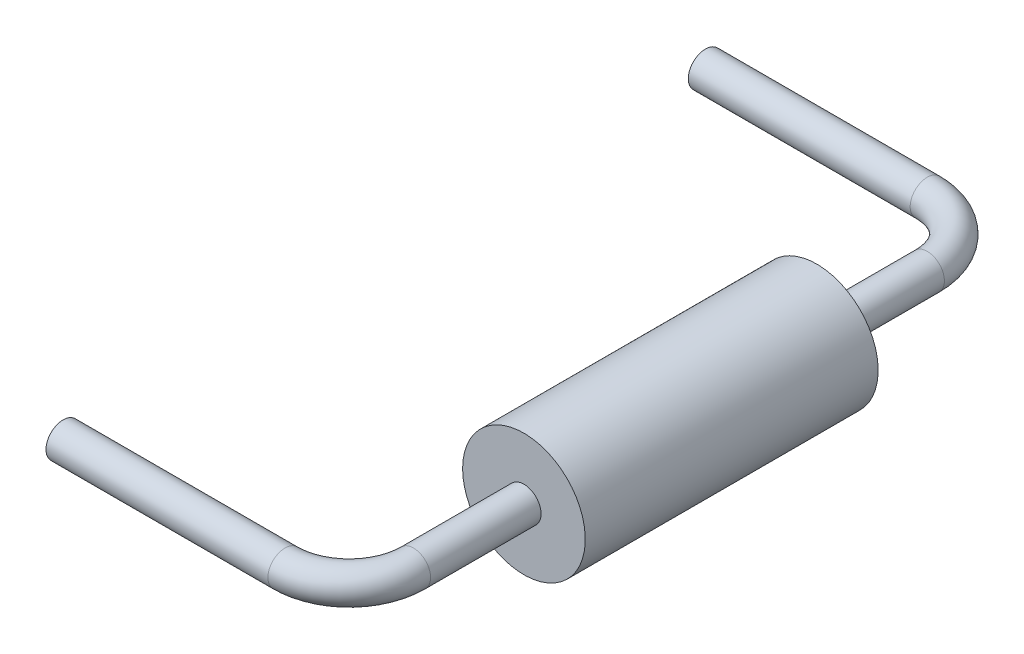
ISO-10303-21;
HEADER;
FILE_DESCRIPTION(('STEP AP214'),'2;1');
FILE_NAME('part.step','',(''),(''),'','','');
FILE_SCHEMA(('AUTOMOTIVE_DESIGN { 1 0 10303 214 1 1 1 1 }'));
ENDSEC;
DATA;
#1=APPLICATION_CONTEXT('core data for automotive mechanical design processes');
#2=APPLICATION_PROTOCOL_DEFINITION('international standard','automotive_design',2000,#1);
#3=PRODUCT_CONTEXT('',#1,'mechanical');
#4=PRODUCT('Part','Part','',(#3));
#5=PRODUCT_RELATED_PRODUCT_CATEGORY('part','',(#4));
#6=PRODUCT_DEFINITION_FORMATION('','',#4);
#7=PRODUCT_DEFINITION_CONTEXT('part definition',#1,'design');
#8=PRODUCT_DEFINITION('design','',#6,#7);
#9=PRODUCT_DEFINITION_SHAPE('','',#8);
#10=(LENGTH_UNIT() NAMED_UNIT(*) SI_UNIT(.MILLI.,.METRE.));
#11=(NAMED_UNIT(*) PLANE_ANGLE_UNIT() SI_UNIT($,.RADIAN.));
#12=(NAMED_UNIT(*) SI_UNIT($,.STERADIAN.) SOLID_ANGLE_UNIT());
#13=UNCERTAINTY_MEASURE_WITH_UNIT(LENGTH_MEASURE(1.E-05),#10,'distance_accuracy_value','');
#14=(GEOMETRIC_REPRESENTATION_CONTEXT(3) GLOBAL_UNCERTAINTY_ASSIGNED_CONTEXT((#13)) GLOBAL_UNIT_ASSIGNED_CONTEXT((#10,
#11,#12)) REPRESENTATION_CONTEXT('',''));
#15=CARTESIAN_POINT('',(0.,0.,0.));
#16=DIRECTION('',(0.,0.,1.));
#17=DIRECTION('',(1.,0.,0.));
#18=AXIS2_PLACEMENT_3D('',#15,#16,#17);
#19=CARTESIAN_POINT('',(-4.455,0.,-5.));
#20=DIRECTION('',(-1.,0.,0.));
#21=DIRECTION('',(0.,0.,1.));
#22=AXIS2_PLACEMENT_3D('',#19,#20,#21);
#23=PLANE('',#22);
#24=CARTESIAN_POINT('',(-4.455,0.,-5.));
#25=DIRECTION('',(-1.,0.,0.));
#26=DIRECTION('',(0.,-1.,0.));
#27=AXIS2_PLACEMENT_3D('',#24,#25,#26);
#28=CIRCLE('',#27,0.2665);
#29=CARTESIAN_POINT('',(-4.455,-0.2665,-5.));
#30=VERTEX_POINT('',#29);
#31=EDGE_CURVE('E18',#30,#30,#28,.F.);
#32=ORIENTED_EDGE('',*,*,#31,.F.);
#33=EDGE_LOOP('',(#32));
#34=FACE_BOUND('',#33,.T.);
#35=ADVANCED_FACE('F15',(#34),#23,.T.);
#36=CARTESIAN_POINT('',(-4.455,0.,5.));
#37=DIRECTION('',(-1.,0.,0.));
#38=DIRECTION('',(0.,0.,1.));
#39=AXIS2_PLACEMENT_3D('',#36,#37,#38);
#40=PLANE('',#39);
#41=CARTESIAN_POINT('',(-4.455,0.,5.));
#42=DIRECTION('',(-1.,0.,0.));
#43=DIRECTION('',(0.,-1.,0.));
#44=AXIS2_PLACEMENT_3D('',#41,#42,#43);
#45=CIRCLE('',#44,0.2665);
#46=CARTESIAN_POINT('',(-4.455,-0.2665,5.));
#47=VERTEX_POINT('',#46);
#48=EDGE_CURVE('E38',#47,#47,#45,.F.);
#49=ORIENTED_EDGE('',*,*,#48,.F.);
#50=EDGE_LOOP('',(#49));
#51=FACE_BOUND('',#50,.T.);
#52=ADVANCED_FACE('F50',(#51),#40,.T.);
#53=CARTESIAN_POINT('',(-1.,0.,-5.));
#54=DIRECTION('',(-1.,0.,0.));
#55=DIRECTION('',(0.,-1.,0.));
#56=AXIS2_PLACEMENT_3D('',#53,#54,#55);
#57=CYLINDRICAL_SURFACE('',#56,0.2665);
#58=CARTESIAN_POINT('',(-1.,0.,-5.));
#59=DIRECTION('',(-1.,0.,0.));
#60=DIRECTION('',(0.,0.,-1.));
#61=AXIS2_PLACEMENT_3D('',#58,#59,#60);
#62=CIRCLE('',#61,0.2665);
#63=CARTESIAN_POINT('',(-0.999999999999999,0.,-5.2665));
#64=VERTEX_POINT('',#63);
#65=EDGE_CURVE('E40',#64,#64,#62,.F.);
#66=ORIENTED_EDGE('',*,*,#65,.F.);
#67=EDGE_LOOP('',(#66));
#68=FACE_BOUND('',#67,.T.);
#69=ORIENTED_EDGE('',*,*,#31,.T.);
#70=EDGE_LOOP('',(#69));
#71=FACE_BOUND('',#70,.T.);
#72=ADVANCED_FACE('F47',(#68,#71),#57,.T.);
#73=CARTESIAN_POINT('',(-1.,0.,5.));
#74=DIRECTION('',(-1.,0.,0.));
#75=DIRECTION('',(0.,-1.,0.));
#76=AXIS2_PLACEMENT_3D('',#73,#74,#75);
#77=CYLINDRICAL_SURFACE('',#76,0.2665);
#78=CARTESIAN_POINT('',(-1.,0.,5.));
#79=DIRECTION('',(-1.,0.,0.));
#80=DIRECTION('',(0.,0.,1.));
#81=AXIS2_PLACEMENT_3D('',#78,#79,#80);
#82=CIRCLE('',#81,0.2665);
#83=CARTESIAN_POINT('',(-0.999999999999999,0.,5.2665));
#84=VERTEX_POINT('',#83);
#85=EDGE_CURVE('E30',#84,#84,#82,.F.);
#86=ORIENTED_EDGE('',*,*,#85,.F.);
#87=EDGE_LOOP('',(#86));
#88=FACE_BOUND('',#87,.T.);
#89=ORIENTED_EDGE('',*,*,#48,.T.);
#90=EDGE_LOOP('',(#89));
#91=FACE_BOUND('',#90,.T.);
#92=ADVANCED_FACE('F99',(#88,#91),#77,.T.);
#93=CARTESIAN_POINT('',(-1.,0.,-4.));
#94=DIRECTION('',(0.,1.,0.));
#95=DIRECTION('',(0.,0.,1.));
#96=AXIS2_PLACEMENT_3D('',#93,#94,#95);
#97=TOROIDAL_SURFACE('',#96,1.,0.2665);
#98=ORIENTED_EDGE('',*,*,#65,.T.);
#99=EDGE_LOOP('',(#98));
#100=FACE_BOUND('',#99,.T.);
#101=CARTESIAN_POINT('',(0.,0.,-4.));
#102=DIRECTION('',(0.,0.,1.));
#103=DIRECTION('',(1.,0.,0.));
#104=AXIS2_PLACEMENT_3D('',#101,#102,#103);
#105=CIRCLE('',#104,0.2665);
#106=CARTESIAN_POINT('',(0.2665,0.,-4.));
#107=VERTEX_POINT('',#106);
#108=EDGE_CURVE('E92',#107,#107,#105,.T.);
#109=ORIENTED_EDGE('',*,*,#108,.F.);
#110=EDGE_LOOP('',(#109));
#111=FACE_BOUND('',#110,.T.);
#112=ADVANCED_FACE('F83',(#100,#111),#97,.T.);
#113=CARTESIAN_POINT('',(-1.,0.,4.));
#114=DIRECTION('',(0.,-1.,0.));
#115=DIRECTION('',(0.,0.,-1.));
#116=AXIS2_PLACEMENT_3D('',#113,#114,#115);
#117=TOROIDAL_SURFACE('',#116,1.,0.2665);
#118=CARTESIAN_POINT('',(0.,0.,4.));
#119=DIRECTION('',(0.,0.,-1.));
#120=DIRECTION('',(-1.,0.,0.));
#121=AXIS2_PLACEMENT_3D('',#118,#119,#120);
#122=CIRCLE('',#121,0.2665);
#123=CARTESIAN_POINT('',(-0.2665,0.,4.));
#124=VERTEX_POINT('',#123);
#125=EDGE_CURVE('E37',#124,#124,#122,.T.);
#126=ORIENTED_EDGE('',*,*,#125,.F.);
#127=EDGE_LOOP('',(#126));
#128=FACE_BOUND('',#127,.T.);
#129=ORIENTED_EDGE('',*,*,#85,.T.);
#130=EDGE_LOOP('',(#129));
#131=FACE_BOUND('',#130,.T.);
#132=ADVANCED_FACE('F78',(#128,#131),#117,.T.);
#133=CARTESIAN_POINT('',(0.,0.,4.));
#134=DIRECTION('',(0.,0.,-1.));
#135=DIRECTION('',(-1.,0.,0.));
#136=AXIS2_PLACEMENT_3D('',#133,#134,#135);
#137=CYLINDRICAL_SURFACE('',#136,0.2665);
#138=CARTESIAN_POINT('',(0.,0.,2.28));
#139=DIRECTION('',(0.,0.,-1.));
#140=DIRECTION('',(-1.,0.,0.));
#141=AXIS2_PLACEMENT_3D('',#138,#139,#140);
#142=CIRCLE('',#141,0.2665);
#143=CARTESIAN_POINT('',(-0.2665,0.,2.28));
#144=VERTEX_POINT('',#143);
#145=EDGE_CURVE('E35',#144,#144,#142,.T.);
#146=ORIENTED_EDGE('',*,*,#145,.F.);
#147=EDGE_LOOP('',(#146));
#148=FACE_BOUND('',#147,.T.);
#149=ORIENTED_EDGE('',*,*,#125,.T.);
#150=EDGE_LOOP('',(#149));
#151=FACE_BOUND('',#150,.T.);
#152=ADVANCED_FACE('F74',(#148,#151),#137,.T.);
#153=CARTESIAN_POINT('',(0.,0.,-4.));
#154=DIRECTION('',(0.,0.,1.));
#155=DIRECTION('',(1.,0.,0.));
#156=AXIS2_PLACEMENT_3D('',#153,#154,#155);
#157=CYLINDRICAL_SURFACE('',#156,0.2665);
#158=ORIENTED_EDGE('',*,*,#108,.T.);
#159=EDGE_LOOP('',(#158));
#160=FACE_BOUND('',#159,.T.);
#161=CARTESIAN_POINT('',(0.,0.,-2.28));
#162=DIRECTION('',(0.,0.,1.));
#163=DIRECTION('',(1.,0.,0.));
#164=AXIS2_PLACEMENT_3D('',#161,#162,#163);
#165=CIRCLE('',#164,0.2665);
#166=CARTESIAN_POINT('',(0.2665,0.,-2.28));
#167=VERTEX_POINT('',#166);
#168=EDGE_CURVE('E27',#167,#167,#165,.F.);
#169=ORIENTED_EDGE('',*,*,#168,.T.);
#170=EDGE_LOOP('',(#169));
#171=FACE_BOUND('',#170,.T.);
#172=ADVANCED_FACE('F70',(#160,#171),#157,.T.);
#173=CARTESIAN_POINT('',(0.,0.,2.28));
#174=DIRECTION('',(0.,0.,1.));
#175=DIRECTION('',(1.,0.,0.));
#176=AXIS2_PLACEMENT_3D('',#173,#174,#175);
#177=PLANE('',#176);
#178=CARTESIAN_POINT('',(0.,0.,2.28));
#179=DIRECTION('',(0.,0.,-1.));
#180=DIRECTION('',(-1.,0.,0.));
#181=AXIS2_PLACEMENT_3D('',#178,#179,#180);
#182=CIRCLE('',#181,0.955);
#183=CARTESIAN_POINT('',(-0.955,0.,2.28));
#184=VERTEX_POINT('',#183);
#185=EDGE_CURVE('E22',#184,#184,#182,.T.);
#186=ORIENTED_EDGE('',*,*,#185,.F.);
#187=EDGE_LOOP('',(#186));
#188=FACE_BOUND('',#187,.T.);
#189=ORIENTED_EDGE('',*,*,#145,.T.);
#190=EDGE_LOOP('',(#189));
#191=FACE_BOUND('',#190,.T.);
#192=ADVANCED_FACE('F63',(#188,#191),#177,.T.);
#193=CARTESIAN_POINT('',(0.,0.,-2.28));
#194=DIRECTION('',(0.,0.,1.));
#195=DIRECTION('',(1.,0.,0.));
#196=AXIS2_PLACEMENT_3D('',#193,#194,#195);
#197=PLANE('',#196);
#198=ORIENTED_EDGE('',*,*,#168,.F.);
#199=EDGE_LOOP('',(#198));
#200=FACE_BOUND('',#199,.T.);
#201=CARTESIAN_POINT('',(0.,0.,-2.28));
#202=DIRECTION('',(0.,0.,-1.));
#203=DIRECTION('',(-1.,0.,0.));
#204=AXIS2_PLACEMENT_3D('',#201,#202,#203);
#205=CIRCLE('',#204,0.955);
#206=CARTESIAN_POINT('',(-0.955,0.,-2.28));
#207=VERTEX_POINT('',#206);
#208=EDGE_CURVE('E10',#207,#207,#205,.F.);
#209=ORIENTED_EDGE('',*,*,#208,.F.);
#210=EDGE_LOOP('',(#209));
#211=FACE_BOUND('',#210,.T.);
#212=ADVANCED_FACE('F58',(#200,#211),#197,.F.);
#213=CARTESIAN_POINT('',(0.,0.,2.28));
#214=DIRECTION('',(0.,0.,-1.));
#215=DIRECTION('',(-1.,0.,0.));
#216=AXIS2_PLACEMENT_3D('',#213,#214,#215);
#217=CYLINDRICAL_SURFACE('',#216,0.955);
#218=ORIENTED_EDGE('',*,*,#208,.T.);
#219=EDGE_LOOP('',(#218));
#220=FACE_BOUND('',#219,.T.);
#221=ORIENTED_EDGE('',*,*,#185,.T.);
#222=EDGE_LOOP('',(#221));
#223=FACE_BOUND('',#222,.T.);
#224=ADVANCED_FACE('F56',(#220,#223),#217,.T.);
#225=CLOSED_SHELL('',(#35,#52,#72,#92,#112,#132,#152,#172,#192,#212,#224));
#226=MANIFOLD_SOLID_BREP('B1',#225);
#227=ADVANCED_BREP_SHAPE_REPRESENTATION('',(#18,#226),#14);
#228=SHAPE_DEFINITION_REPRESENTATION(#9,#227);
ENDSEC;
END-ISO-10303-21;
